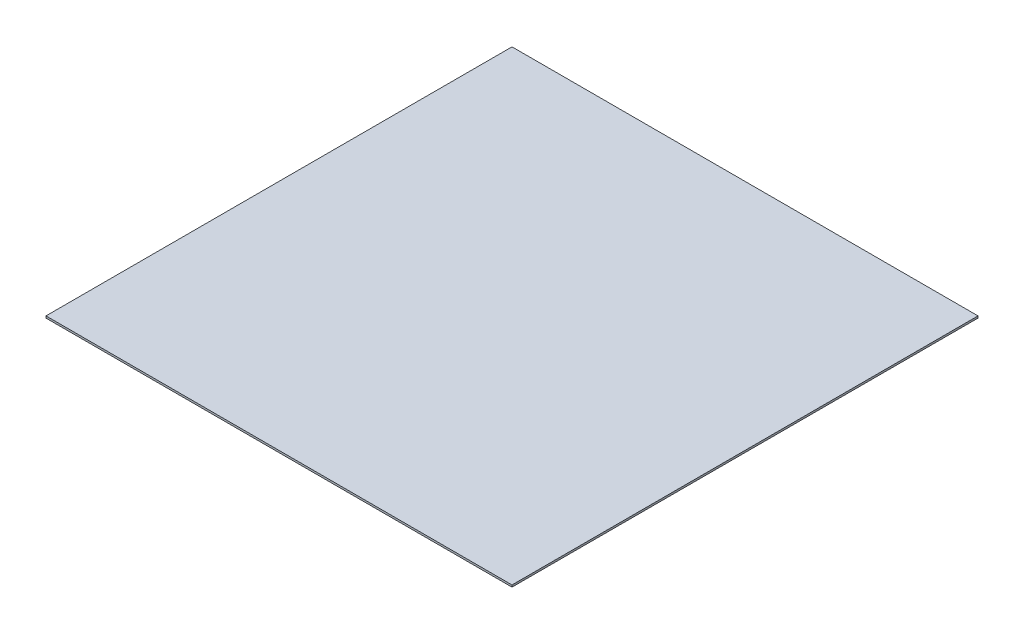
ISO-10303-21;
HEADER;
FILE_DESCRIPTION(('STEP AP214'),'2;1');
FILE_NAME('part.step','',(''),(''),'','','');
FILE_SCHEMA(('AUTOMOTIVE_DESIGN { 1 0 10303 214 1 1 1 1 }'));
ENDSEC;
DATA;
#1=APPLICATION_CONTEXT('core data for automotive mechanical design processes');
#2=APPLICATION_PROTOCOL_DEFINITION('international standard','automotive_design',2000,#1);
#3=PRODUCT_CONTEXT('',#1,'mechanical');
#4=PRODUCT('Part','Part','',(#3));
#5=PRODUCT_RELATED_PRODUCT_CATEGORY('part','',(#4));
#6=PRODUCT_DEFINITION_FORMATION('','',#4);
#7=PRODUCT_DEFINITION_CONTEXT('part definition',#1,'design');
#8=PRODUCT_DEFINITION('design','',#6,#7);
#9=PRODUCT_DEFINITION_SHAPE('','',#8);
#10=(LENGTH_UNIT() NAMED_UNIT(*) SI_UNIT(.MILLI.,.METRE.));
#11=(NAMED_UNIT(*) PLANE_ANGLE_UNIT() SI_UNIT($,.RADIAN.));
#12=(NAMED_UNIT(*) SI_UNIT($,.STERADIAN.) SOLID_ANGLE_UNIT());
#13=UNCERTAINTY_MEASURE_WITH_UNIT(LENGTH_MEASURE(1.E-05),#10,'distance_accuracy_value','');
#14=(GEOMETRIC_REPRESENTATION_CONTEXT(3) GLOBAL_UNCERTAINTY_ASSIGNED_CONTEXT((#13)) GLOBAL_UNIT_ASSIGNED_CONTEXT((#10,
#11,#12)) REPRESENTATION_CONTEXT('',''));
#15=CARTESIAN_POINT('',(0.,0.,0.));
#16=DIRECTION('',(0.,0.,1.));
#17=DIRECTION('',(1.,0.,0.));
#18=AXIS2_PLACEMENT_3D('',#15,#16,#17);
#19=CARTESIAN_POINT('',(12192.,10868.8293766007,-12192.));
#20=DIRECTION('',(0.,0.,1.));
#21=DIRECTION('',(1.,0.,0.));
#22=AXIS2_PLACEMENT_3D('',#19,#20,#21);
#23=PLANE('',#22);
#24=DIRECTION('',(-1.,0.,0.));
#25=VECTOR('',#24,1.);
#26=CARTESIAN_POINT('',(0.,0.,-12192.));
#27=LINE('',#26,#25);
#28=CARTESIAN_POINT('',(12192.,0.,-12192.));
#29=VERTEX_POINT('',#28);
#30=CARTESIAN_POINT('',(0.,0.,-12192.));
#31=VERTEX_POINT('',#30);
#32=EDGE_CURVE('E98',#29,#31,#27,.T.);
#33=ORIENTED_EDGE('',*,*,#32,.T.);
#34=DIRECTION('',(0.,-1.,0.));
#35=VECTOR('',#34,1.);
#36=CARTESIAN_POINT('',(0.,50.8,-12192.));
#37=LINE('',#36,#35);
#38=CARTESIAN_POINT('',(0.,50.8,-12192.));
#39=VERTEX_POINT('',#38);
#40=EDGE_CURVE('E87',#39,#31,#37,.T.);
#41=ORIENTED_EDGE('',*,*,#40,.F.);
#42=DIRECTION('',(-1.,0.,0.));
#43=VECTOR('',#42,1.);
#44=CARTESIAN_POINT('',(0.,50.8,-12192.));
#45=LINE('',#44,#43);
#46=CARTESIAN_POINT('',(12192.,50.8,-12192.));
#47=VERTEX_POINT('',#46);
#48=EDGE_CURVE('E38',#47,#39,#45,.T.);
#49=ORIENTED_EDGE('',*,*,#48,.F.);
#50=DIRECTION('',(0.,1.,0.));
#51=VECTOR('',#50,1.);
#52=CARTESIAN_POINT('',(12192.,50.8,-12192.));
#53=LINE('',#52,#51);
#54=EDGE_CURVE('E77',#29,#47,#53,.T.);
#55=ORIENTED_EDGE('',*,*,#54,.F.);
#56=EDGE_LOOP('',(#33,#41,#49,#55));
#57=FACE_BOUND('',#56,.T.);
#58=ADVANCED_FACE('F34',(#57),#23,.F.);
#59=CARTESIAN_POINT('',(0.,50.8,-12192.));
#60=DIRECTION('',(1.,0.,0.));
#61=DIRECTION('',(0.,0.,-1.));
#62=AXIS2_PLACEMENT_3D('',#59,#60,#61);
#63=PLANE('',#62);
#64=DIRECTION('',(0.,0.,1.));
#65=VECTOR('',#64,1.);
#66=CARTESIAN_POINT('',(0.,50.8,0.));
#67=LINE('',#66,#65);
#68=CARTESIAN_POINT('',(0.,50.8,0.));
#69=VERTEX_POINT('',#68);
#70=EDGE_CURVE('E93',#39,#69,#67,.T.);
#71=ORIENTED_EDGE('',*,*,#70,.F.);
#72=ORIENTED_EDGE('',*,*,#40,.T.);
#73=DIRECTION('',(0.,0.,1.));
#74=VECTOR('',#73,1.);
#75=CARTESIAN_POINT('',(0.,0.,0.));
#76=LINE('',#75,#74);
#77=CARTESIAN_POINT('',(0.,0.,0.));
#78=VERTEX_POINT('',#77);
#79=EDGE_CURVE('E99',#31,#78,#76,.T.);
#80=ORIENTED_EDGE('',*,*,#79,.T.);
#81=DIRECTION('',(0.,-1.,0.));
#82=VECTOR('',#81,1.);
#83=CARTESIAN_POINT('',(0.,50.8,0.));
#84=LINE('',#83,#82);
#85=EDGE_CURVE('E84',#69,#78,#84,.T.);
#86=ORIENTED_EDGE('',*,*,#85,.F.);
#87=EDGE_LOOP('',(#71,#72,#80,#86));
#88=FACE_BOUND('',#87,.T.);
#89=ADVANCED_FACE('F105',(#88),#63,.F.);
#90=CARTESIAN_POINT('',(0.,50.8,0.));
#91=DIRECTION('',(0.,-1.,0.));
#92=DIRECTION('',(0.,0.,-1.));
#93=AXIS2_PLACEMENT_3D('',#90,#91,#92);
#94=PLANE('',#93);
#95=ORIENTED_EDGE('',*,*,#70,.T.);
#96=DIRECTION('',(1.,0.,0.));
#97=VECTOR('',#96,1.);
#98=CARTESIAN_POINT('',(0.,50.8,0.));
#99=LINE('',#98,#97);
#100=CARTESIAN_POINT('',(12192.,50.8,0.));
#101=VERTEX_POINT('',#100);
#102=EDGE_CURVE('E91',#69,#101,#99,.T.);
#103=ORIENTED_EDGE('',*,*,#102,.T.);
#104=DIRECTION('',(0.,0.,-1.));
#105=VECTOR('',#104,1.);
#106=CARTESIAN_POINT('',(12192.,50.8,0.));
#107=LINE('',#106,#105);
#108=EDGE_CURVE('E79',#101,#47,#107,.T.);
#109=ORIENTED_EDGE('',*,*,#108,.T.);
#110=ORIENTED_EDGE('',*,*,#48,.T.);
#111=EDGE_LOOP('',(#95,#103,#109,#110));
#112=FACE_BOUND('',#111,.T.);
#113=ADVANCED_FACE('F89',(#112),#94,.F.);
#114=CARTESIAN_POINT('',(0.,50.8,0.));
#115=DIRECTION('',(0.,0.,-1.));
#116=DIRECTION('',(-1.,0.,0.));
#117=AXIS2_PLACEMENT_3D('',#114,#115,#116);
#118=PLANE('',#117);
#119=ORIENTED_EDGE('',*,*,#102,.F.);
#120=ORIENTED_EDGE('',*,*,#85,.T.);
#121=DIRECTION('',(1.,0.,0.));
#122=VECTOR('',#121,1.);
#123=CARTESIAN_POINT('',(0.,0.,0.));
#124=LINE('',#123,#122);
#125=CARTESIAN_POINT('',(12192.,0.,0.));
#126=VERTEX_POINT('',#125);
#127=EDGE_CURVE('E11',#78,#126,#124,.T.);
#128=ORIENTED_EDGE('',*,*,#127,.T.);
#129=DIRECTION('',(0.,-1.,0.));
#130=VECTOR('',#129,1.);
#131=CARTESIAN_POINT('',(12192.,50.8,0.));
#132=LINE('',#131,#130);
#133=EDGE_CURVE('E83',#101,#126,#132,.T.);
#134=ORIENTED_EDGE('',*,*,#133,.F.);
#135=EDGE_LOOP('',(#119,#120,#128,#134));
#136=FACE_BOUND('',#135,.T.);
#137=ADVANCED_FACE('F36',(#136),#118,.F.);
#138=CARTESIAN_POINT('',(12192.,50.8,0.));
#139=DIRECTION('',(-1.,0.,0.));
#140=DIRECTION('',(0.,0.,1.));
#141=AXIS2_PLACEMENT_3D('',#138,#139,#140);
#142=PLANE('',#141);
#143=DIRECTION('',(0.,0.,-1.));
#144=VECTOR('',#143,1.);
#145=CARTESIAN_POINT('',(12192.,0.,0.));
#146=LINE('',#145,#144);
#147=EDGE_CURVE('E43',#126,#29,#146,.T.);
#148=ORIENTED_EDGE('',*,*,#147,.T.);
#149=ORIENTED_EDGE('',*,*,#54,.T.);
#150=ORIENTED_EDGE('',*,*,#108,.F.);
#151=ORIENTED_EDGE('',*,*,#133,.T.);
#152=EDGE_LOOP('',(#148,#149,#150,#151));
#153=FACE_BOUND('',#152,.T.);
#154=ADVANCED_FACE('F78',(#153),#142,.F.);
#155=CARTESIAN_POINT('',(0.,0.,0.));
#156=DIRECTION('',(0.,-1.,0.));
#157=DIRECTION('',(0.,0.,-1.));
#158=AXIS2_PLACEMENT_3D('',#155,#156,#157);
#159=PLANE('',#158);
#160=ORIENTED_EDGE('',*,*,#32,.F.);
#161=ORIENTED_EDGE('',*,*,#147,.F.);
#162=ORIENTED_EDGE('',*,*,#127,.F.);
#163=ORIENTED_EDGE('',*,*,#79,.F.);
#164=EDGE_LOOP('',(#160,#161,#162,#163));
#165=FACE_BOUND('',#164,.T.);
#166=ADVANCED_FACE('F108',(#165),#159,.T.);
#167=CLOSED_SHELL('',(#58,#89,#113,#137,#154,#166));
#168=MANIFOLD_SOLID_BREP('B2',#167);
#169=ADVANCED_BREP_SHAPE_REPRESENTATION('',(#18,#168),#14);
#170=SHAPE_DEFINITION_REPRESENTATION(#9,#169);
ENDSEC;
END-ISO-10303-21;
